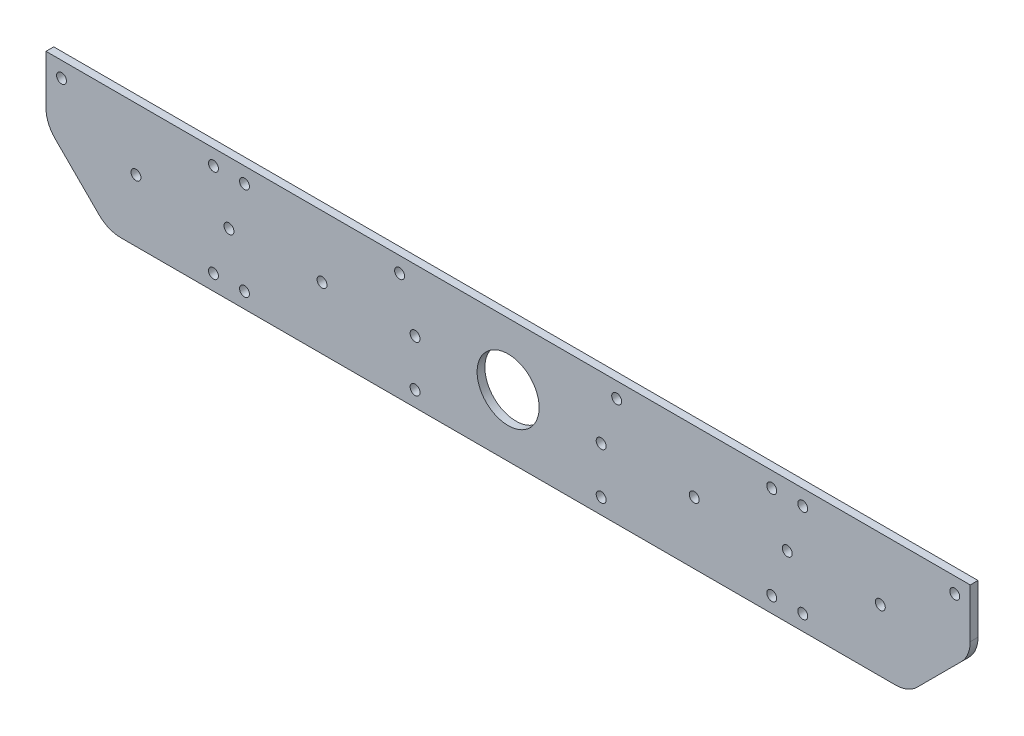
ISO-10303-21;
HEADER;
FILE_DESCRIPTION(('STEP AP214'),'2;1');
FILE_NAME('part.step','',(''),(''),'','','');
FILE_SCHEMA(('AUTOMOTIVE_DESIGN { 1 0 10303 214 1 1 1 1 }'));
ENDSEC;
DATA;
#1=APPLICATION_CONTEXT('core data for automotive mechanical design processes');
#2=APPLICATION_PROTOCOL_DEFINITION('international standard','automotive_design',2000,#1);
#3=PRODUCT_CONTEXT('',#1,'mechanical');
#4=PRODUCT('Part','Part','',(#3));
#5=PRODUCT_RELATED_PRODUCT_CATEGORY('part','',(#4));
#6=PRODUCT_DEFINITION_FORMATION('','',#4);
#7=PRODUCT_DEFINITION_CONTEXT('part definition',#1,'design');
#8=PRODUCT_DEFINITION('design','',#6,#7);
#9=PRODUCT_DEFINITION_SHAPE('','',#8);
#10=(LENGTH_UNIT() NAMED_UNIT(*) SI_UNIT(.MILLI.,.METRE.));
#11=(NAMED_UNIT(*) PLANE_ANGLE_UNIT() SI_UNIT($,.RADIAN.));
#12=(NAMED_UNIT(*) SI_UNIT($,.STERADIAN.) SOLID_ANGLE_UNIT());
#13=UNCERTAINTY_MEASURE_WITH_UNIT(LENGTH_MEASURE(1.E-05),#10,'distance_accuracy_value','');
#14=(GEOMETRIC_REPRESENTATION_CONTEXT(3) GLOBAL_UNCERTAINTY_ASSIGNED_CONTEXT((#13)) GLOBAL_UNIT_ASSIGNED_CONTEXT((#10,
#11,#12)) REPRESENTATION_CONTEXT('',''));
#15=CARTESIAN_POINT('',(0.,0.,0.));
#16=DIRECTION('',(0.,0.,1.));
#17=DIRECTION('',(1.,0.,0.));
#18=AXIS2_PLACEMENT_3D('',#15,#16,#17);
#19=CARTESIAN_POINT('',(0.,0.,3.175));
#20=DIRECTION('',(0.,0.,-1.));
#21=DIRECTION('',(-1.,0.,0.));
#22=AXIS2_PLACEMENT_3D('',#19,#20,#21);
#23=PLANE('',#22);
#24=CARTESIAN_POINT('',(182.88,19.05,3.175));
#25=DIRECTION('',(0.,0.,-1.));
#26=DIRECTION('',(-1.,0.,0.));
#27=AXIS2_PLACEMENT_3D('',#24,#25,#26);
#28=CIRCLE('',#27,2.03200000000001);
#29=CARTESIAN_POINT('',(180.848,19.05,3.175));
#30=VERTEX_POINT('',#29);
#31=EDGE_CURVE('E197',#30,#30,#28,.T.);
#32=ORIENTED_EDGE('',*,*,#31,.T.);
#33=EDGE_LOOP('',(#32));
#34=FACE_BOUND('',#33,.T.);
#35=CARTESIAN_POINT('',(107.95,19.05,3.175));
#36=DIRECTION('',(0.,0.,-1.));
#37=DIRECTION('',(-1.,0.,0.));
#38=AXIS2_PLACEMENT_3D('',#35,#36,#37);
#39=CIRCLE('',#38,2.03200000000001);
#40=CARTESIAN_POINT('',(105.918,19.05,3.175));
#41=VERTEX_POINT('',#40);
#42=EDGE_CURVE('E207',#41,#41,#39,.T.);
#43=ORIENTED_EDGE('',*,*,#42,.T.);
#44=EDGE_LOOP('',(#43));
#45=FACE_BOUND('',#44,.T.);
#46=CARTESIAN_POINT('',(120.65,19.0499999999999,3.175));
#47=DIRECTION('',(0.,0.,-1.));
#48=DIRECTION('',(-1.,0.,0.));
#49=AXIS2_PLACEMENT_3D('',#46,#47,#48);
#50=CIRCLE('',#49,2.03200000000001);
#51=CARTESIAN_POINT('',(118.618,19.0499999999999,3.175));
#52=VERTEX_POINT('',#51);
#53=EDGE_CURVE('E220',#52,#52,#50,.T.);
#54=ORIENTED_EDGE('',*,*,#53,.T.);
#55=EDGE_LOOP('',(#54));
#56=FACE_BOUND('',#55,.T.);
#57=CARTESIAN_POINT('',(120.65,-19.0500000000001,3.175));
#58=DIRECTION('',(0.,0.,-1.));
#59=DIRECTION('',(-1.,0.,0.));
#60=AXIS2_PLACEMENT_3D('',#57,#58,#59);
#61=CIRCLE('',#60,2.03200000000001);
#62=CARTESIAN_POINT('',(118.618,-19.0500000000001,3.175));
#63=VERTEX_POINT('',#62);
#64=EDGE_CURVE('E214',#63,#63,#61,.T.);
#65=ORIENTED_EDGE('',*,*,#64,.T.);
#66=EDGE_LOOP('',(#65));
#67=FACE_BOUND('',#66,.T.);
#68=CARTESIAN_POINT('',(107.95,-19.05,3.175));
#69=DIRECTION('',(0.,0.,-1.));
#70=DIRECTION('',(-1.,0.,0.));
#71=AXIS2_PLACEMENT_3D('',#68,#69,#70);
#72=CIRCLE('',#71,2.03200000000001);
#73=CARTESIAN_POINT('',(105.918,-19.05,3.175));
#74=VERTEX_POINT('',#73);
#75=EDGE_CURVE('E213',#74,#74,#72,.T.);
#76=ORIENTED_EDGE('',*,*,#75,.T.);
#77=EDGE_LOOP('',(#76));
#78=FACE_BOUND('',#77,.T.);
#79=CARTESIAN_POINT('',(-182.88,19.05,3.175));
#80=DIRECTION('',(0.,0.,1.));
#81=DIRECTION('',(1.,0.,0.));
#82=AXIS2_PLACEMENT_3D('',#79,#80,#81);
#83=CIRCLE('',#82,2.03200000000001);
#84=CARTESIAN_POINT('',(-180.848,19.05,3.175));
#85=VERTEX_POINT('',#84);
#86=EDGE_CURVE('E231',#85,#85,#83,.T.);
#87=ORIENTED_EDGE('',*,*,#86,.F.);
#88=EDGE_LOOP('',(#87));
#89=FACE_BOUND('',#88,.T.);
#90=CARTESIAN_POINT('',(-107.95,19.05,3.175));
#91=DIRECTION('',(0.,0.,1.));
#92=DIRECTION('',(1.,0.,0.));
#93=AXIS2_PLACEMENT_3D('',#90,#91,#92);
#94=CIRCLE('',#93,2.03200000000001);
#95=CARTESIAN_POINT('',(-105.918,19.05,3.175));
#96=VERTEX_POINT('',#95);
#97=EDGE_CURVE('E237',#96,#96,#94,.T.);
#98=ORIENTED_EDGE('',*,*,#97,.F.);
#99=EDGE_LOOP('',(#98));
#100=FACE_BOUND('',#99,.T.);
#101=CARTESIAN_POINT('',(-120.65,19.0499999999999,3.175));
#102=DIRECTION('',(0.,0.,1.));
#103=DIRECTION('',(1.,0.,0.));
#104=AXIS2_PLACEMENT_3D('',#101,#102,#103);
#105=CIRCLE('',#104,2.03200000000001);
#106=CARTESIAN_POINT('',(-118.618,19.0499999999999,3.175));
#107=VERTEX_POINT('',#106);
#108=EDGE_CURVE('E252',#107,#107,#105,.T.);
#109=ORIENTED_EDGE('',*,*,#108,.F.);
#110=EDGE_LOOP('',(#109));
#111=FACE_BOUND('',#110,.T.);
#112=CARTESIAN_POINT('',(-120.65,-19.0500000000001,3.175));
#113=DIRECTION('',(0.,0.,1.));
#114=DIRECTION('',(1.,0.,0.));
#115=AXIS2_PLACEMENT_3D('',#112,#113,#114);
#116=CIRCLE('',#115,2.03200000000001);
#117=CARTESIAN_POINT('',(-118.618,-19.0500000000001,3.175));
#118=VERTEX_POINT('',#117);
#119=EDGE_CURVE('E245',#118,#118,#116,.T.);
#120=ORIENTED_EDGE('',*,*,#119,.F.);
#121=EDGE_LOOP('',(#120));
#122=FACE_BOUND('',#121,.T.);
#123=CARTESIAN_POINT('',(-107.95,-19.05,3.175));
#124=DIRECTION('',(0.,0.,1.));
#125=DIRECTION('',(1.,0.,0.));
#126=AXIS2_PLACEMENT_3D('',#123,#124,#125);
#127=CIRCLE('',#126,2.03200000000001);
#128=CARTESIAN_POINT('',(-105.918,-19.05,3.175));
#129=VERTEX_POINT('',#128);
#130=EDGE_CURVE('E244',#129,#129,#127,.T.);
#131=ORIENTED_EDGE('',*,*,#130,.F.);
#132=EDGE_LOOP('',(#131));
#133=FACE_BOUND('',#132,.T.);
#134=CARTESIAN_POINT('',(38.0999999999998,-19.0500000000006,3.175));
#135=DIRECTION('',(0.,0.,1.));
#136=DIRECTION('',(1.,0.,0.));
#137=AXIS2_PLACEMENT_3D('',#134,#135,#136);
#138=CIRCLE('',#137,2.03199999999934);
#139=CARTESIAN_POINT('',(40.1319999999991,-19.0500000000006,3.175));
#140=VERTEX_POINT('',#139);
#141=EDGE_CURVE('E264',#140,#140,#138,.T.);
#142=ORIENTED_EDGE('',*,*,#141,.F.);
#143=EDGE_LOOP('',(#142));
#144=FACE_BOUND('',#143,.T.);
#145=CARTESIAN_POINT('',(44.4499999999998,19.0499999999994,3.175));
#146=DIRECTION('',(0.,0.,1.));
#147=DIRECTION('',(1.,0.,0.));
#148=AXIS2_PLACEMENT_3D('',#145,#146,#147);
#149=CIRCLE('',#148,2.03199999999934);
#150=CARTESIAN_POINT('',(46.4819999999991,19.0499999999994,3.175));
#151=VERTEX_POINT('',#150);
#152=EDGE_CURVE('E278',#151,#151,#149,.T.);
#153=ORIENTED_EDGE('',*,*,#152,.F.);
#154=EDGE_LOOP('',(#153));
#155=FACE_BOUND('',#154,.T.);
#156=CARTESIAN_POINT('',(-44.4500000000002,19.0499999999994,3.175));
#157=DIRECTION('',(0.,0.,1.));
#158=DIRECTION('',(1.,0.,0.));
#159=AXIS2_PLACEMENT_3D('',#156,#157,#158);
#160=CIRCLE('',#159,2.03199999999934);
#161=CARTESIAN_POINT('',(-42.4180000000009,19.0499999999994,3.175));
#162=VERTEX_POINT('',#161);
#163=EDGE_CURVE('E272',#162,#162,#160,.T.);
#164=ORIENTED_EDGE('',*,*,#163,.F.);
#165=EDGE_LOOP('',(#164));
#166=FACE_BOUND('',#165,.T.);
#167=CARTESIAN_POINT('',(-38.1000000000003,-19.0500000000006,3.175));
#168=DIRECTION('',(0.,0.,1.));
#169=DIRECTION('',(1.,0.,0.));
#170=AXIS2_PLACEMENT_3D('',#167,#168,#169);
#171=CIRCLE('',#170,2.03199999999934);
#172=CARTESIAN_POINT('',(-36.0680000000009,-19.0500000000006,3.175));
#173=VERTEX_POINT('',#172);
#174=EDGE_CURVE('E271',#173,#173,#171,.T.);
#175=ORIENTED_EDGE('',*,*,#174,.F.);
#176=EDGE_LOOP('',(#175));
#177=FACE_BOUND('',#176,.T.);
#178=CARTESIAN_POINT('',(0.,0.,3.175));
#179=DIRECTION('',(0.,0.,1.));
#180=DIRECTION('',(1.,0.,0.));
#181=AXIS2_PLACEMENT_3D('',#178,#179,#180);
#182=CIRCLE('',#181,12.6999999999993);
#183=CARTESIAN_POINT('',(12.6999999999993,0.,3.175));
#184=VERTEX_POINT('',#183);
#185=EDGE_CURVE('E289',#184,#184,#182,.T.);
#186=ORIENTED_EDGE('',*,*,#185,.F.);
#187=EDGE_LOOP('',(#186));
#188=FACE_BOUND('',#187,.T.);
#189=DIRECTION('',(-0.707106781186547,-0.707106781186547,0.));
#190=VECTOR('',#189,1.);
#191=CARTESIAN_POINT('',(189.23,0.,3.175));
#192=LINE('',#191,#190);
#193=CARTESIAN_POINT('',(185.510256121069,-3.71974387893083,3.175));
#194=VERTEX_POINT('',#193);
#195=CARTESIAN_POINT('',(167.549743878931,-21.6802561210691,3.175));
#196=VERTEX_POINT('',#195);
#197=EDGE_CURVE('E199',#194,#196,#192,.T.);
#198=ORIENTED_EDGE('',*,*,#197,.F.);
#199=CARTESIAN_POINT('',(176.53,5.26051224213832,3.175));
#200=DIRECTION('',(0.,0.,-1.));
#201=DIRECTION('',(-1.,0.,0.));
#202=AXIS2_PLACEMENT_3D('',#199,#200,#201);
#203=CIRCLE('',#202,12.7);
#204=CARTESIAN_POINT('',(189.23,5.26051224213832,3.175));
#205=VERTEX_POINT('',#204);
#206=EDGE_CURVE('E122',#194,#205,#203,.F.);
#207=ORIENTED_EDGE('',*,*,#206,.T.);
#208=DIRECTION('',(0.,1.,0.));
#209=VECTOR('',#208,1.);
#210=CARTESIAN_POINT('',(189.23,-25.4,3.175));
#211=LINE('',#210,#209);
#212=CARTESIAN_POINT('',(189.23,25.4,3.175));
#213=VERTEX_POINT('',#212);
#214=EDGE_CURVE('E114',#205,#213,#211,.T.);
#215=ORIENTED_EDGE('',*,*,#214,.T.);
#216=DIRECTION('',(-1.,0.,0.));
#217=VECTOR('',#216,1.);
#218=CARTESIAN_POINT('',(-189.23,25.4,3.175));
#219=LINE('',#218,#217);
#220=CARTESIAN_POINT('',(-189.23,25.4,3.175));
#221=VERTEX_POINT('',#220);
#222=EDGE_CURVE('E120',#213,#221,#219,.T.);
#223=ORIENTED_EDGE('',*,*,#222,.T.);
#224=DIRECTION('',(0.,-1.,0.));
#225=VECTOR('',#224,1.);
#226=CARTESIAN_POINT('',(-189.23,-25.4,3.175));
#227=LINE('',#226,#225);
#228=CARTESIAN_POINT('',(-189.23,5.26051224213832,3.175));
#229=VERTEX_POINT('',#228);
#230=EDGE_CURVE('E153',#221,#229,#227,.T.);
#231=ORIENTED_EDGE('',*,*,#230,.T.);
#232=CARTESIAN_POINT('',(-176.53,5.26051224213832,3.175));
#233=DIRECTION('',(0.,0.,-1.));
#234=DIRECTION('',(-1.,0.,0.));
#235=AXIS2_PLACEMENT_3D('',#232,#233,#234);
#236=CIRCLE('',#235,12.7);
#237=CARTESIAN_POINT('',(-185.510256121069,-3.71974387893084,3.175));
#238=VERTEX_POINT('',#237);
#239=EDGE_CURVE('E161',#229,#238,#236,.F.);
#240=ORIENTED_EDGE('',*,*,#239,.T.);
#241=DIRECTION('',(-0.707106781186547,0.707106781186547,0.));
#242=VECTOR('',#241,1.);
#243=CARTESIAN_POINT('',(-189.23,0.,3.175));
#244=LINE('',#243,#242);
#245=CARTESIAN_POINT('',(-167.549743878931,-21.6802561210692,3.175));
#246=VERTEX_POINT('',#245);
#247=EDGE_CURVE('E188',#246,#238,#244,.T.);
#248=ORIENTED_EDGE('',*,*,#247,.F.);
#249=CARTESIAN_POINT('',(-158.569487757862,-12.7,3.175));
#250=DIRECTION('',(0.,0.,-1.));
#251=DIRECTION('',(-1.,0.,0.));
#252=AXIS2_PLACEMENT_3D('',#249,#250,#251);
#253=CIRCLE('',#252,12.7);
#254=CARTESIAN_POINT('',(-158.569487757862,-25.4,3.175));
#255=VERTEX_POINT('',#254);
#256=EDGE_CURVE('E159',#246,#255,#253,.F.);
#257=ORIENTED_EDGE('',*,*,#256,.T.);
#258=DIRECTION('',(1.,0.,0.));
#259=VECTOR('',#258,1.);
#260=CARTESIAN_POINT('',(-189.23,-25.4,3.175));
#261=LINE('',#260,#259);
#262=CARTESIAN_POINT('',(158.569487757862,-25.4,3.175));
#263=VERTEX_POINT('',#262);
#264=EDGE_CURVE('E125',#255,#263,#261,.T.);
#265=ORIENTED_EDGE('',*,*,#264,.T.);
#266=CARTESIAN_POINT('',(158.569487757862,-12.7,3.175));
#267=DIRECTION('',(0.,0.,-1.));
#268=DIRECTION('',(-1.,0.,0.));
#269=AXIS2_PLACEMENT_3D('',#266,#267,#268);
#270=CIRCLE('',#269,12.7);
#271=EDGE_CURVE('E163',#263,#196,#270,.F.);
#272=ORIENTED_EDGE('',*,*,#271,.T.);
#273=EDGE_LOOP('',(#198,#207,#215,#223,#231,#240,#248,#257,#265,#272));
#274=FACE_BOUND('',#273,.T.);
#275=CARTESIAN_POINT('',(76.2,-5.13478148889135E-13,3.175));
#276=DIRECTION('',(0.,0.,1.));
#277=DIRECTION('',(-1.,0.,0.));
#278=AXIS2_PLACEMENT_3D('',#275,#276,#277);
#279=CIRCLE('',#278,2.03199999999999);
#280=CARTESIAN_POINT('',(74.168,-5.13478148889135E-13,3.175));
#281=VERTEX_POINT('',#280);
#282=EDGE_CURVE('E148',#281,#281,#279,.T.);
#283=ORIENTED_EDGE('',*,*,#282,.F.);
#284=EDGE_LOOP('',(#283));
#285=FACE_BOUND('',#284,.T.);
#286=CARTESIAN_POINT('',(-38.1,-2.67147415300428E-13,3.175));
#287=DIRECTION('',(0.,0.,1.));
#288=DIRECTION('',(1.,0.,0.));
#289=AXIS2_PLACEMENT_3D('',#286,#287,#288);
#290=CIRCLE('',#289,2.032);
#291=CARTESIAN_POINT('',(-36.068,-2.67147415300428E-13,3.175));
#292=VERTEX_POINT('',#291);
#293=EDGE_CURVE('E336',#292,#292,#290,.T.);
#294=ORIENTED_EDGE('',*,*,#293,.F.);
#295=EDGE_LOOP('',(#294));
#296=FACE_BOUND('',#295,.T.);
#297=CARTESIAN_POINT('',(-76.2,-5.30825383648903E-13,3.175));
#298=DIRECTION('',(0.,0.,1.));
#299=DIRECTION('',(1.,0.,0.));
#300=AXIS2_PLACEMENT_3D('',#297,#298,#299);
#301=CIRCLE('',#300,2.03199999999999);
#302=CARTESIAN_POINT('',(-74.168,-5.30825383648903E-13,3.175));
#303=VERTEX_POINT('',#302);
#304=EDGE_CURVE('E330',#303,#303,#301,.T.);
#305=ORIENTED_EDGE('',*,*,#304,.F.);
#306=EDGE_LOOP('',(#305));
#307=FACE_BOUND('',#306,.T.);
#308=CARTESIAN_POINT('',(-114.3,-7.97972798949331E-13,3.175));
#309=DIRECTION('',(0.,0.,1.));
#310=DIRECTION('',(1.,0.,0.));
#311=AXIS2_PLACEMENT_3D('',#308,#309,#310);
#312=CIRCLE('',#311,2.03199999999999);
#313=CARTESIAN_POINT('',(-112.268,-7.97972798949331E-13,3.175));
#314=VERTEX_POINT('',#313);
#315=EDGE_CURVE('E322',#314,#314,#312,.T.);
#316=ORIENTED_EDGE('',*,*,#315,.F.);
#317=EDGE_LOOP('',(#316));
#318=FACE_BOUND('',#317,.T.);
#319=CARTESIAN_POINT('',(-152.4,-1.06512021424976E-12,3.175));
#320=DIRECTION('',(0.,0.,1.));
#321=DIRECTION('',(1.,0.,0.));
#322=AXIS2_PLACEMENT_3D('',#319,#320,#321);
#323=CIRCLE('',#322,2.03200000000001);
#324=CARTESIAN_POINT('',(-150.368,-1.06512021424976E-12,3.175));
#325=VERTEX_POINT('',#324);
#326=EDGE_CURVE('E316',#325,#325,#323,.T.);
#327=ORIENTED_EDGE('',*,*,#326,.F.);
#328=EDGE_LOOP('',(#327));
#329=FACE_BOUND('',#328,.T.);
#330=CARTESIAN_POINT('',(114.3,-7.70217223333702E-13,3.175));
#331=DIRECTION('',(0.,0.,1.));
#332=DIRECTION('',(-1.,0.,0.));
#333=AXIS2_PLACEMENT_3D('',#330,#331,#332);
#334=CIRCLE('',#333,2.03199999999999);
#335=CARTESIAN_POINT('',(112.268,-7.70217223333702E-13,3.175));
#336=VERTEX_POINT('',#335);
#337=EDGE_CURVE('E310',#336,#336,#334,.T.);
#338=ORIENTED_EDGE('',*,*,#337,.F.);
#339=EDGE_LOOP('',(#338));
#340=FACE_BOUND('',#339,.T.);
#341=CARTESIAN_POINT('',(152.4,-1.02695629777827E-12,3.175));
#342=DIRECTION('',(0.,0.,1.));
#343=DIRECTION('',(-1.,0.,0.));
#344=AXIS2_PLACEMENT_3D('',#341,#342,#343);
#345=CIRCLE('',#344,2.03200000000001);
#346=CARTESIAN_POINT('',(150.368,-1.02695629777827E-12,3.175));
#347=VERTEX_POINT('',#346);
#348=EDGE_CURVE('E304',#347,#347,#345,.T.);
#349=ORIENTED_EDGE('',*,*,#348,.F.);
#350=EDGE_LOOP('',(#349));
#351=FACE_BOUND('',#350,.T.);
#352=CARTESIAN_POINT('',(38.1,-2.56739074444567E-13,3.175));
#353=DIRECTION('',(0.,0.,1.));
#354=DIRECTION('',(-1.,0.,0.));
#355=AXIS2_PLACEMENT_3D('',#352,#353,#354);
#356=CIRCLE('',#355,2.032);
#357=CARTESIAN_POINT('',(36.068,-2.56739074444567E-13,3.175));
#358=VERTEX_POINT('',#357);
#359=EDGE_CURVE('E298',#358,#358,#356,.T.);
#360=ORIENTED_EDGE('',*,*,#359,.F.);
#361=EDGE_LOOP('',(#360));
#362=FACE_BOUND('',#361,.T.);
#363=ADVANCED_FACE('F37',(#34,#45,#56,#67,#78,#89,#100,#111,#122,#133,#144,#155,#166,#177,#188,
#274,#285,#296,#307,#318,#329,#340,#351,#362),#23,.F.);
#364=CARTESIAN_POINT('',(0.,0.,0.));
#365=DIRECTION('',(0.,0.,-1.));
#366=DIRECTION('',(-1.,0.,0.));
#367=AXIS2_PLACEMENT_3D('',#364,#365,#366);
#368=PLANE('',#367);
#369=DIRECTION('',(0.,1.,0.));
#370=VECTOR('',#369,1.);
#371=CARTESIAN_POINT('',(189.23,-25.4,0.));
#372=LINE('',#371,#370);
#373=CARTESIAN_POINT('',(189.23,5.26051224213832,0.));
#374=VERTEX_POINT('',#373);
#375=CARTESIAN_POINT('',(189.23,25.4,0.));
#376=VERTEX_POINT('',#375);
#377=EDGE_CURVE('E131',#374,#376,#372,.T.);
#378=ORIENTED_EDGE('',*,*,#377,.F.);
#379=CARTESIAN_POINT('',(176.53,5.26051224213832,0.));
#380=DIRECTION('',(0.,0.,-1.));
#381=DIRECTION('',(-1.,0.,0.));
#382=AXIS2_PLACEMENT_3D('',#379,#380,#381);
#383=CIRCLE('',#382,12.7);
#384=CARTESIAN_POINT('',(185.510256121069,-3.71974387893083,0.));
#385=VERTEX_POINT('',#384);
#386=EDGE_CURVE('E173',#374,#385,#383,.T.);
#387=ORIENTED_EDGE('',*,*,#386,.T.);
#388=DIRECTION('',(-0.707106781186547,-0.707106781186547,0.));
#389=VECTOR('',#388,1.);
#390=CARTESIAN_POINT('',(189.23,0.,0.));
#391=LINE('',#390,#389);
#392=CARTESIAN_POINT('',(167.549743878931,-21.6802561210691,0.));
#393=VERTEX_POINT('',#392);
#394=EDGE_CURVE('E195',#385,#393,#391,.T.);
#395=ORIENTED_EDGE('',*,*,#394,.T.);
#396=CARTESIAN_POINT('',(158.569487757862,-12.7,0.));
#397=DIRECTION('',(0.,0.,-1.));
#398=DIRECTION('',(-1.,0.,0.));
#399=AXIS2_PLACEMENT_3D('',#396,#397,#398);
#400=CIRCLE('',#399,12.7);
#401=CARTESIAN_POINT('',(158.569487757862,-25.4,0.));
#402=VERTEX_POINT('',#401);
#403=EDGE_CURVE('E52',#393,#402,#400,.T.);
#404=ORIENTED_EDGE('',*,*,#403,.T.);
#405=DIRECTION('',(1.,0.,0.));
#406=VECTOR('',#405,1.);
#407=CARTESIAN_POINT('',(-189.23,-25.4,0.));
#408=LINE('',#407,#406);
#409=CARTESIAN_POINT('',(-158.569487757862,-25.4,0.));
#410=VERTEX_POINT('',#409);
#411=EDGE_CURVE('E147',#410,#402,#408,.T.);
#412=ORIENTED_EDGE('',*,*,#411,.F.);
#413=CARTESIAN_POINT('',(-158.569487757862,-12.7,0.));
#414=DIRECTION('',(0.,0.,-1.));
#415=DIRECTION('',(-1.,0.,0.));
#416=AXIS2_PLACEMENT_3D('',#413,#414,#415);
#417=CIRCLE('',#416,12.7);
#418=CARTESIAN_POINT('',(-167.549743878931,-21.6802561210692,0.));
#419=VERTEX_POINT('',#418);
#420=EDGE_CURVE('E168',#410,#419,#417,.T.);
#421=ORIENTED_EDGE('',*,*,#420,.T.);
#422=DIRECTION('',(-0.707106781186547,0.707106781186547,0.));
#423=VECTOR('',#422,1.);
#424=CARTESIAN_POINT('',(-189.23,0.,0.));
#425=LINE('',#424,#423);
#426=CARTESIAN_POINT('',(-185.510256121069,-3.71974387893084,0.));
#427=VERTEX_POINT('',#426);
#428=EDGE_CURVE('E191',#419,#427,#425,.T.);
#429=ORIENTED_EDGE('',*,*,#428,.T.);
#430=CARTESIAN_POINT('',(-176.53,5.26051224213832,0.));
#431=DIRECTION('',(0.,0.,-1.));
#432=DIRECTION('',(-1.,0.,0.));
#433=AXIS2_PLACEMENT_3D('',#430,#431,#432);
#434=CIRCLE('',#433,12.7);
#435=CARTESIAN_POINT('',(-189.23,5.26051224213832,0.));
#436=VERTEX_POINT('',#435);
#437=EDGE_CURVE('E170',#427,#436,#434,.T.);
#438=ORIENTED_EDGE('',*,*,#437,.T.);
#439=DIRECTION('',(0.,-1.,0.));
#440=VECTOR('',#439,1.);
#441=CARTESIAN_POINT('',(-189.23,-25.4,0.));
#442=LINE('',#441,#440);
#443=CARTESIAN_POINT('',(-189.23,25.4,0.));
#444=VERTEX_POINT('',#443);
#445=EDGE_CURVE('E144',#444,#436,#442,.T.);
#446=ORIENTED_EDGE('',*,*,#445,.F.);
#447=DIRECTION('',(-1.,0.,0.));
#448=VECTOR('',#447,1.);
#449=CARTESIAN_POINT('',(-189.23,25.4,0.));
#450=LINE('',#449,#448);
#451=EDGE_CURVE('E152',#376,#444,#450,.T.);
#452=ORIENTED_EDGE('',*,*,#451,.F.);
#453=EDGE_LOOP('',(#378,#387,#395,#404,#412,#421,#429,#438,#446,#452));
#454=FACE_BOUND('',#453,.T.);
#455=CARTESIAN_POINT('',(182.88,19.05,0.));
#456=DIRECTION('',(0.,0.,-1.));
#457=DIRECTION('',(-1.,0.,0.));
#458=AXIS2_PLACEMENT_3D('',#455,#456,#457);
#459=CIRCLE('',#458,2.03200000000001);
#460=CARTESIAN_POINT('',(180.848,19.05,0.));
#461=VERTEX_POINT('',#460);
#462=EDGE_CURVE('E204',#461,#461,#459,.T.);
#463=ORIENTED_EDGE('',*,*,#462,.F.);
#464=EDGE_LOOP('',(#463));
#465=FACE_BOUND('',#464,.T.);
#466=CARTESIAN_POINT('',(107.95,19.05,0.));
#467=DIRECTION('',(0.,0.,-1.));
#468=DIRECTION('',(-1.,0.,0.));
#469=AXIS2_PLACEMENT_3D('',#466,#467,#468);
#470=CIRCLE('',#469,2.03200000000001);
#471=CARTESIAN_POINT('',(105.918,19.05,0.));
#472=VERTEX_POINT('',#471);
#473=EDGE_CURVE('E223',#472,#472,#470,.T.);
#474=ORIENTED_EDGE('',*,*,#473,.F.);
#475=EDGE_LOOP('',(#474));
#476=FACE_BOUND('',#475,.T.);
#477=CARTESIAN_POINT('',(120.65,19.0499999999999,0.));
#478=DIRECTION('',(0.,0.,-1.));
#479=DIRECTION('',(-1.,0.,0.));
#480=AXIS2_PLACEMENT_3D('',#477,#478,#479);
#481=CIRCLE('',#480,2.03200000000001);
#482=CARTESIAN_POINT('',(118.618,19.0499999999999,0.));
#483=VERTEX_POINT('',#482);
#484=EDGE_CURVE('E217',#483,#483,#481,.T.);
#485=ORIENTED_EDGE('',*,*,#484,.F.);
#486=EDGE_LOOP('',(#485));
#487=FACE_BOUND('',#486,.T.);
#488=CARTESIAN_POINT('',(120.65,-19.0500000000001,0.));
#489=DIRECTION('',(0.,0.,-1.));
#490=DIRECTION('',(-1.,0.,0.));
#491=AXIS2_PLACEMENT_3D('',#488,#489,#490);
#492=CIRCLE('',#491,2.03200000000001);
#493=CARTESIAN_POINT('',(118.618,-19.0500000000001,0.));
#494=VERTEX_POINT('',#493);
#495=EDGE_CURVE('E210',#494,#494,#492,.T.);
#496=ORIENTED_EDGE('',*,*,#495,.F.);
#497=EDGE_LOOP('',(#496));
#498=FACE_BOUND('',#497,.T.);
#499=CARTESIAN_POINT('',(107.95,-19.05,0.));
#500=DIRECTION('',(0.,0.,-1.));
#501=DIRECTION('',(-1.,0.,0.));
#502=AXIS2_PLACEMENT_3D('',#499,#500,#501);
#503=CIRCLE('',#502,2.03200000000001);
#504=CARTESIAN_POINT('',(105.918,-19.05,0.));
#505=VERTEX_POINT('',#504);
#506=EDGE_CURVE('E228',#505,#505,#503,.T.);
#507=ORIENTED_EDGE('',*,*,#506,.F.);
#508=EDGE_LOOP('',(#507));
#509=FACE_BOUND('',#508,.T.);
#510=CARTESIAN_POINT('',(-182.88,19.05,0.));
#511=DIRECTION('',(0.,0.,1.));
#512=DIRECTION('',(1.,0.,0.));
#513=AXIS2_PLACEMENT_3D('',#510,#511,#512);
#514=CIRCLE('',#513,2.03200000000001);
#515=CARTESIAN_POINT('',(-180.848,19.05,0.));
#516=VERTEX_POINT('',#515);
#517=EDGE_CURVE('E234',#516,#516,#514,.T.);
#518=ORIENTED_EDGE('',*,*,#517,.T.);
#519=EDGE_LOOP('',(#518));
#520=FACE_BOUND('',#519,.T.);
#521=CARTESIAN_POINT('',(-107.95,19.05,0.));
#522=DIRECTION('',(0.,0.,1.));
#523=DIRECTION('',(1.,0.,0.));
#524=AXIS2_PLACEMENT_3D('',#521,#522,#523);
#525=CIRCLE('',#524,2.03200000000001);
#526=CARTESIAN_POINT('',(-105.918,19.05,0.));
#527=VERTEX_POINT('',#526);
#528=EDGE_CURVE('E255',#527,#527,#525,.T.);
#529=ORIENTED_EDGE('',*,*,#528,.T.);
#530=EDGE_LOOP('',(#529));
#531=FACE_BOUND('',#530,.T.);
#532=CARTESIAN_POINT('',(-120.65,19.0499999999999,0.));
#533=DIRECTION('',(0.,0.,1.));
#534=DIRECTION('',(1.,0.,0.));
#535=AXIS2_PLACEMENT_3D('',#532,#533,#534);
#536=CIRCLE('',#535,2.03200000000001);
#537=CARTESIAN_POINT('',(-118.618,19.0499999999999,0.));
#538=VERTEX_POINT('',#537);
#539=EDGE_CURVE('E249',#538,#538,#536,.T.);
#540=ORIENTED_EDGE('',*,*,#539,.T.);
#541=EDGE_LOOP('',(#540));
#542=FACE_BOUND('',#541,.T.);
#543=CARTESIAN_POINT('',(-120.65,-19.0500000000001,0.));
#544=DIRECTION('',(0.,0.,1.));
#545=DIRECTION('',(1.,0.,0.));
#546=AXIS2_PLACEMENT_3D('',#543,#544,#545);
#547=CIRCLE('',#546,2.03200000000001);
#548=CARTESIAN_POINT('',(-118.618,-19.0500000000001,0.));
#549=VERTEX_POINT('',#548);
#550=EDGE_CURVE('E240',#549,#549,#547,.T.);
#551=ORIENTED_EDGE('',*,*,#550,.T.);
#552=EDGE_LOOP('',(#551));
#553=FACE_BOUND('',#552,.T.);
#554=CARTESIAN_POINT('',(-107.95,-19.05,0.));
#555=DIRECTION('',(0.,0.,1.));
#556=DIRECTION('',(1.,0.,0.));
#557=AXIS2_PLACEMENT_3D('',#554,#555,#556);
#558=CIRCLE('',#557,2.03200000000001);
#559=CARTESIAN_POINT('',(-105.918,-19.05,0.));
#560=VERTEX_POINT('',#559);
#561=EDGE_CURVE('E260',#560,#560,#558,.T.);
#562=ORIENTED_EDGE('',*,*,#561,.T.);
#563=EDGE_LOOP('',(#562));
#564=FACE_BOUND('',#563,.T.);
#565=CARTESIAN_POINT('',(38.0999999999998,-19.0500000000006,0.));
#566=DIRECTION('',(0.,0.,1.));
#567=DIRECTION('',(1.,0.,0.));
#568=AXIS2_PLACEMENT_3D('',#565,#566,#567);
#569=CIRCLE('',#568,2.03199999999934);
#570=CARTESIAN_POINT('',(40.1319999999991,-19.0500000000006,0.));
#571=VERTEX_POINT('',#570);
#572=EDGE_CURVE('E281',#571,#571,#569,.T.);
#573=ORIENTED_EDGE('',*,*,#572,.T.);
#574=EDGE_LOOP('',(#573));
#575=FACE_BOUND('',#574,.T.);
#576=CARTESIAN_POINT('',(44.4499999999998,19.0499999999994,0.));
#577=DIRECTION('',(0.,0.,1.));
#578=DIRECTION('',(1.,0.,0.));
#579=AXIS2_PLACEMENT_3D('',#576,#577,#578);
#580=CIRCLE('',#579,2.03199999999934);
#581=CARTESIAN_POINT('',(46.4819999999991,19.0499999999994,0.));
#582=VERTEX_POINT('',#581);
#583=EDGE_CURVE('E275',#582,#582,#580,.T.);
#584=ORIENTED_EDGE('',*,*,#583,.T.);
#585=EDGE_LOOP('',(#584));
#586=FACE_BOUND('',#585,.T.);
#587=CARTESIAN_POINT('',(-44.4500000000002,19.0499999999994,0.));
#588=DIRECTION('',(0.,0.,1.));
#589=DIRECTION('',(1.,0.,0.));
#590=AXIS2_PLACEMENT_3D('',#587,#588,#589);
#591=CIRCLE('',#590,2.03199999999934);
#592=CARTESIAN_POINT('',(-42.4180000000009,19.0499999999994,0.));
#593=VERTEX_POINT('',#592);
#594=EDGE_CURVE('E268',#593,#593,#591,.T.);
#595=ORIENTED_EDGE('',*,*,#594,.T.);
#596=EDGE_LOOP('',(#595));
#597=FACE_BOUND('',#596,.T.);
#598=CARTESIAN_POINT('',(-38.1000000000003,-19.0500000000006,0.));
#599=DIRECTION('',(0.,0.,1.));
#600=DIRECTION('',(1.,0.,0.));
#601=AXIS2_PLACEMENT_3D('',#598,#599,#600);
#602=CIRCLE('',#601,2.03199999999934);
#603=CARTESIAN_POINT('',(-36.0680000000009,-19.0500000000006,0.));
#604=VERTEX_POINT('',#603);
#605=EDGE_CURVE('E286',#604,#604,#602,.T.);
#606=ORIENTED_EDGE('',*,*,#605,.T.);
#607=EDGE_LOOP('',(#606));
#608=FACE_BOUND('',#607,.T.);
#609=CARTESIAN_POINT('',(0.,0.,0.));
#610=DIRECTION('',(0.,0.,1.));
#611=DIRECTION('',(1.,0.,0.));
#612=AXIS2_PLACEMENT_3D('',#609,#610,#611);
#613=CIRCLE('',#612,12.6999999999993);
#614=CARTESIAN_POINT('',(12.6999999999993,0.,0.));
#615=VERTEX_POINT('',#614);
#616=EDGE_CURVE('E292',#615,#615,#613,.T.);
#617=ORIENTED_EDGE('',*,*,#616,.T.);
#618=EDGE_LOOP('',(#617));
#619=FACE_BOUND('',#618,.T.);
#620=CARTESIAN_POINT('',(152.4,-1.02695629777827E-12,0.));
#621=DIRECTION('',(0.,0.,1.));
#622=DIRECTION('',(-1.,0.,0.));
#623=AXIS2_PLACEMENT_3D('',#620,#621,#622);
#624=CIRCLE('',#623,2.03200000000001);
#625=CARTESIAN_POINT('',(150.368,-1.02695629777827E-12,0.));
#626=VERTEX_POINT('',#625);
#627=EDGE_CURVE('E301',#626,#626,#624,.T.);
#628=ORIENTED_EDGE('',*,*,#627,.T.);
#629=EDGE_LOOP('',(#628));
#630=FACE_BOUND('',#629,.T.);
#631=CARTESIAN_POINT('',(-152.4,-1.06512021424976E-12,0.));
#632=DIRECTION('',(0.,0.,1.));
#633=DIRECTION('',(1.,0.,0.));
#634=AXIS2_PLACEMENT_3D('',#631,#632,#633);
#635=CIRCLE('',#634,2.03200000000001);
#636=CARTESIAN_POINT('',(-150.368,-1.06512021424976E-12,0.));
#637=VERTEX_POINT('',#636);
#638=EDGE_CURVE('E313',#637,#637,#635,.T.);
#639=ORIENTED_EDGE('',*,*,#638,.T.);
#640=EDGE_LOOP('',(#639));
#641=FACE_BOUND('',#640,.T.);
#642=CARTESIAN_POINT('',(-76.2,-5.30825383648903E-13,0.));
#643=DIRECTION('',(0.,0.,1.));
#644=DIRECTION('',(1.,0.,0.));
#645=AXIS2_PLACEMENT_3D('',#642,#643,#644);
#646=CIRCLE('',#645,2.03199999999999);
#647=CARTESIAN_POINT('',(-74.168,-5.30825383648903E-13,0.));
#648=VERTEX_POINT('',#647);
#649=EDGE_CURVE('E326',#648,#648,#646,.T.);
#650=ORIENTED_EDGE('',*,*,#649,.T.);
#651=EDGE_LOOP('',(#650));
#652=FACE_BOUND('',#651,.T.);
#653=CARTESIAN_POINT('',(76.2,-5.13478148889135E-13,0.));
#654=DIRECTION('',(0.,0.,1.));
#655=DIRECTION('',(-1.,0.,0.));
#656=AXIS2_PLACEMENT_3D('',#653,#654,#655);
#657=CIRCLE('',#656,2.03199999999999);
#658=CARTESIAN_POINT('',(74.168,-5.13478148889135E-13,0.));
#659=VERTEX_POINT('',#658);
#660=EDGE_CURVE('E339',#659,#659,#657,.T.);
#661=ORIENTED_EDGE('',*,*,#660,.T.);
#662=EDGE_LOOP('',(#661));
#663=FACE_BOUND('',#662,.T.);
#664=CARTESIAN_POINT('',(-38.1,-2.67147415300428E-13,0.));
#665=DIRECTION('',(0.,0.,1.));
#666=DIRECTION('',(1.,0.,0.));
#667=AXIS2_PLACEMENT_3D('',#664,#665,#666);
#668=CIRCLE('',#667,2.032);
#669=CARTESIAN_POINT('',(-36.068,-2.67147415300428E-13,0.));
#670=VERTEX_POINT('',#669);
#671=EDGE_CURVE('E333',#670,#670,#668,.T.);
#672=ORIENTED_EDGE('',*,*,#671,.T.);
#673=EDGE_LOOP('',(#672));
#674=FACE_BOUND('',#673,.T.);
#675=CARTESIAN_POINT('',(-114.3,-7.97972798949331E-13,0.));
#676=DIRECTION('',(0.,0.,1.));
#677=DIRECTION('',(1.,0.,0.));
#678=AXIS2_PLACEMENT_3D('',#675,#676,#677);
#679=CIRCLE('',#678,2.03199999999999);
#680=CARTESIAN_POINT('',(-112.268,-7.97972798949331E-13,0.));
#681=VERTEX_POINT('',#680);
#682=EDGE_CURVE('E319',#681,#681,#679,.T.);
#683=ORIENTED_EDGE('',*,*,#682,.T.);
#684=EDGE_LOOP('',(#683));
#685=FACE_BOUND('',#684,.T.);
#686=CARTESIAN_POINT('',(114.3,-7.70217223333702E-13,0.));
#687=DIRECTION('',(0.,0.,1.));
#688=DIRECTION('',(-1.,0.,0.));
#689=AXIS2_PLACEMENT_3D('',#686,#687,#688);
#690=CIRCLE('',#689,2.03199999999999);
#691=CARTESIAN_POINT('',(112.268,-7.70217223333702E-13,0.));
#692=VERTEX_POINT('',#691);
#693=EDGE_CURVE('E307',#692,#692,#690,.T.);
#694=ORIENTED_EDGE('',*,*,#693,.T.);
#695=EDGE_LOOP('',(#694));
#696=FACE_BOUND('',#695,.T.);
#697=CARTESIAN_POINT('',(38.1,-2.56739074444567E-13,0.));
#698=DIRECTION('',(0.,0.,1.));
#699=DIRECTION('',(-1.,0.,0.));
#700=AXIS2_PLACEMENT_3D('',#697,#698,#699);
#701=CIRCLE('',#700,2.032);
#702=CARTESIAN_POINT('',(36.068,-2.56739074444567E-13,0.));
#703=VERTEX_POINT('',#702);
#704=EDGE_CURVE('E295',#703,#703,#701,.T.);
#705=ORIENTED_EDGE('',*,*,#704,.T.);
#706=EDGE_LOOP('',(#705));
#707=FACE_BOUND('',#706,.T.);
#708=ADVANCED_FACE('F349',(#454,#465,#476,#487,#498,#509,#520,#531,#542,#553,#564,#575,#586,
#597,#608,#619,#630,#641,#652,#663,#674,#685,#696,#707),#368,.T.);
#709=CARTESIAN_POINT('',(-189.23,-25.4,3.175));
#710=DIRECTION('',(1.,0.,0.));
#711=DIRECTION('',(0.,0.,-1.));
#712=AXIS2_PLACEMENT_3D('',#709,#710,#711);
#713=PLANE('',#712);
#714=ORIENTED_EDGE('',*,*,#445,.T.);
#715=DIRECTION('',(0.,0.,1.));
#716=VECTOR('',#715,1.);
#717=CARTESIAN_POINT('',(-189.23,5.26051224213832,3.175));
#718=LINE('',#717,#716);
#719=EDGE_CURVE('E179',#436,#229,#718,.T.);
#720=ORIENTED_EDGE('',*,*,#719,.T.);
#721=ORIENTED_EDGE('',*,*,#230,.F.);
#722=DIRECTION('',(0.,0.,-1.));
#723=VECTOR('',#722,1.);
#724=CARTESIAN_POINT('',(-189.23,25.4,3.175));
#725=LINE('',#724,#723);
#726=EDGE_CURVE('E135',#221,#444,#725,.T.);
#727=ORIENTED_EDGE('',*,*,#726,.T.);
#728=EDGE_LOOP('',(#714,#720,#721,#727));
#729=FACE_BOUND('',#728,.T.);
#730=ADVANCED_FACE('F378',(#729),#713,.F.);
#731=CARTESIAN_POINT('',(-189.23,-25.4,3.175));
#732=DIRECTION('',(0.,1.,0.));
#733=DIRECTION('',(-1.,0.,0.));
#734=AXIS2_PLACEMENT_3D('',#731,#732,#733);
#735=PLANE('',#734);
#736=ORIENTED_EDGE('',*,*,#411,.T.);
#737=DIRECTION('',(0.,0.,1.));
#738=VECTOR('',#737,1.);
#739=CARTESIAN_POINT('',(158.569487757862,-25.4,3.175));
#740=LINE('',#739,#738);
#741=EDGE_CURVE('E176',#402,#263,#740,.T.);
#742=ORIENTED_EDGE('',*,*,#741,.T.);
#743=ORIENTED_EDGE('',*,*,#264,.F.);
#744=DIRECTION('',(0.,0.,1.));
#745=VECTOR('',#744,1.);
#746=CARTESIAN_POINT('',(-158.569487757862,-25.4,3.175));
#747=LINE('',#746,#745);
#748=EDGE_CURVE('E59',#255,#410,#747,.F.);
#749=ORIENTED_EDGE('',*,*,#748,.T.);
#750=EDGE_LOOP('',(#736,#742,#743,#749));
#751=FACE_BOUND('',#750,.T.);
#752=ADVANCED_FACE('F347',(#751),#735,.F.);
#753=CARTESIAN_POINT('',(189.23,-25.4,3.175));
#754=DIRECTION('',(-1.,0.,0.));
#755=DIRECTION('',(0.,0.,1.));
#756=AXIS2_PLACEMENT_3D('',#753,#754,#755);
#757=PLANE('',#756);
#758=ORIENTED_EDGE('',*,*,#214,.F.);
#759=DIRECTION('',(0.,0.,1.));
#760=VECTOR('',#759,1.);
#761=CARTESIAN_POINT('',(189.23,5.26051224213832,3.175));
#762=LINE('',#761,#760);
#763=EDGE_CURVE('E166',#205,#374,#762,.F.);
#764=ORIENTED_EDGE('',*,*,#763,.T.);
#765=ORIENTED_EDGE('',*,*,#377,.T.);
#766=DIRECTION('',(0.,0.,-1.));
#767=VECTOR('',#766,1.);
#768=CARTESIAN_POINT('',(189.23,25.4,3.175));
#769=LINE('',#768,#767);
#770=EDGE_CURVE('E128',#213,#376,#769,.T.);
#771=ORIENTED_EDGE('',*,*,#770,.F.);
#772=EDGE_LOOP('',(#758,#764,#765,#771));
#773=FACE_BOUND('',#772,.T.);
#774=ADVANCED_FACE('F129',(#773),#757,.F.);
#775=CARTESIAN_POINT('',(-189.23,25.4,3.175));
#776=DIRECTION('',(0.,-1.,0.));
#777=DIRECTION('',(1.,0.,0.));
#778=AXIS2_PLACEMENT_3D('',#775,#776,#777);
#779=PLANE('',#778);
#780=ORIENTED_EDGE('',*,*,#451,.T.);
#781=ORIENTED_EDGE('',*,*,#726,.F.);
#782=ORIENTED_EDGE('',*,*,#222,.F.);
#783=ORIENTED_EDGE('',*,*,#770,.T.);
#784=EDGE_LOOP('',(#780,#781,#782,#783));
#785=FACE_BOUND('',#784,.T.);
#786=ADVANCED_FACE('F137',(#785),#779,.F.);
#787=CARTESIAN_POINT('',(76.2,-5.13478148889135E-13,3.175));
#788=DIRECTION('',(0.,0.,-1.));
#789=DIRECTION('',(-1.,0.,0.));
#790=AXIS2_PLACEMENT_3D('',#787,#788,#789);
#791=CYLINDRICAL_SURFACE('',#790,2.03199999999999);
#792=ORIENTED_EDGE('',*,*,#282,.T.);
#793=EDGE_LOOP('',(#792));
#794=FACE_BOUND('',#793,.T.);
#795=ORIENTED_EDGE('',*,*,#660,.F.);
#796=EDGE_LOOP('',(#795));
#797=FACE_BOUND('',#796,.T.);
#798=ADVANCED_FACE('F382',(#794,#797),#791,.F.);
#799=CARTESIAN_POINT('',(-38.1,-2.67147415300428E-13,3.175));
#800=DIRECTION('',(0.,0.,-1.));
#801=DIRECTION('',(-1.,0.,0.));
#802=AXIS2_PLACEMENT_3D('',#799,#800,#801);
#803=CYLINDRICAL_SURFACE('',#802,2.032);
#804=ORIENTED_EDGE('',*,*,#293,.T.);
#805=EDGE_LOOP('',(#804));
#806=FACE_BOUND('',#805,.T.);
#807=ORIENTED_EDGE('',*,*,#671,.F.);
#808=EDGE_LOOP('',(#807));
#809=FACE_BOUND('',#808,.T.);
#810=ADVANCED_FACE('F669',(#806,#809),#803,.F.);
#811=CARTESIAN_POINT('',(-76.2,-5.30825383648903E-13,3.175));
#812=DIRECTION('',(0.,0.,-1.));
#813=DIRECTION('',(-1.,0.,0.));
#814=AXIS2_PLACEMENT_3D('',#811,#812,#813);
#815=CYLINDRICAL_SURFACE('',#814,2.03199999999999);
#816=ORIENTED_EDGE('',*,*,#304,.T.);
#817=EDGE_LOOP('',(#816));
#818=FACE_BOUND('',#817,.T.);
#819=ORIENTED_EDGE('',*,*,#649,.F.);
#820=EDGE_LOOP('',(#819));
#821=FACE_BOUND('',#820,.T.);
#822=ADVANCED_FACE('F659',(#818,#821),#815,.F.);
#823=CARTESIAN_POINT('',(-114.3,-7.97972798949331E-13,3.175));
#824=DIRECTION('',(0.,0.,-1.));
#825=DIRECTION('',(-1.,0.,0.));
#826=AXIS2_PLACEMENT_3D('',#823,#824,#825);
#827=CYLINDRICAL_SURFACE('',#826,2.03199999999999);
#828=ORIENTED_EDGE('',*,*,#315,.T.);
#829=EDGE_LOOP('',(#828));
#830=FACE_BOUND('',#829,.T.);
#831=ORIENTED_EDGE('',*,*,#682,.F.);
#832=EDGE_LOOP('',(#831));
#833=FACE_BOUND('',#832,.T.);
#834=ADVANCED_FACE('F649',(#830,#833),#827,.F.);
#835=CARTESIAN_POINT('',(-152.4,-1.06512021424976E-12,3.175));
#836=DIRECTION('',(0.,0.,-1.));
#837=DIRECTION('',(-1.,0.,0.));
#838=AXIS2_PLACEMENT_3D('',#835,#836,#837);
#839=CYLINDRICAL_SURFACE('',#838,2.03200000000001);
#840=ORIENTED_EDGE('',*,*,#326,.T.);
#841=EDGE_LOOP('',(#840));
#842=FACE_BOUND('',#841,.T.);
#843=ORIENTED_EDGE('',*,*,#638,.F.);
#844=EDGE_LOOP('',(#843));
#845=FACE_BOUND('',#844,.T.);
#846=ADVANCED_FACE('F639',(#842,#845),#839,.F.);
#847=CARTESIAN_POINT('',(114.3,-7.70217223333702E-13,3.175));
#848=DIRECTION('',(0.,0.,-1.));
#849=DIRECTION('',(-1.,0.,0.));
#850=AXIS2_PLACEMENT_3D('',#847,#848,#849);
#851=CYLINDRICAL_SURFACE('',#850,2.03199999999999);
#852=ORIENTED_EDGE('',*,*,#337,.T.);
#853=EDGE_LOOP('',(#852));
#854=FACE_BOUND('',#853,.T.);
#855=ORIENTED_EDGE('',*,*,#693,.F.);
#856=EDGE_LOOP('',(#855));
#857=FACE_BOUND('',#856,.T.);
#858=ADVANCED_FACE('F629',(#854,#857),#851,.F.);
#859=CARTESIAN_POINT('',(152.4,-1.02695629777827E-12,3.175));
#860=DIRECTION('',(0.,0.,-1.));
#861=DIRECTION('',(-1.,0.,0.));
#862=AXIS2_PLACEMENT_3D('',#859,#860,#861);
#863=CYLINDRICAL_SURFACE('',#862,2.03200000000001);
#864=ORIENTED_EDGE('',*,*,#348,.T.);
#865=EDGE_LOOP('',(#864));
#866=FACE_BOUND('',#865,.T.);
#867=ORIENTED_EDGE('',*,*,#627,.F.);
#868=EDGE_LOOP('',(#867));
#869=FACE_BOUND('',#868,.T.);
#870=ADVANCED_FACE('F619',(#866,#869),#863,.F.);
#871=CARTESIAN_POINT('',(38.1,-2.56739074444567E-13,3.175));
#872=DIRECTION('',(0.,0.,-1.));
#873=DIRECTION('',(-1.,0.,0.));
#874=AXIS2_PLACEMENT_3D('',#871,#872,#873);
#875=CYLINDRICAL_SURFACE('',#874,2.032);
#876=ORIENTED_EDGE('',*,*,#359,.T.);
#877=EDGE_LOOP('',(#876));
#878=FACE_BOUND('',#877,.T.);
#879=ORIENTED_EDGE('',*,*,#704,.F.);
#880=EDGE_LOOP('',(#879));
#881=FACE_BOUND('',#880,.T.);
#882=ADVANCED_FACE('F609',(#878,#881),#875,.F.);
#883=CARTESIAN_POINT('',(0.,0.,0.));
#884=DIRECTION('',(0.,0.,1.));
#885=DIRECTION('',(1.,0.,0.));
#886=AXIS2_PLACEMENT_3D('',#883,#884,#885);
#887=CYLINDRICAL_SURFACE('',#886,12.6999999999993);
#888=ORIENTED_EDGE('',*,*,#616,.F.);
#889=EDGE_LOOP('',(#888));
#890=FACE_BOUND('',#889,.T.);
#891=ORIENTED_EDGE('',*,*,#185,.T.);
#892=EDGE_LOOP('',(#891));
#893=FACE_BOUND('',#892,.T.);
#894=ADVANCED_FACE('F599',(#890,#893),#887,.F.);
#895=CARTESIAN_POINT('',(-38.1000000000003,-19.0500000000006,0.));
#896=DIRECTION('',(0.,0.,1.));
#897=DIRECTION('',(1.,0.,0.));
#898=AXIS2_PLACEMENT_3D('',#895,#896,#897);
#899=CYLINDRICAL_SURFACE('',#898,2.03199999999934);
#900=ORIENTED_EDGE('',*,*,#605,.F.);
#901=EDGE_LOOP('',(#900));
#902=FACE_BOUND('',#901,.T.);
#903=ORIENTED_EDGE('',*,*,#174,.T.);
#904=EDGE_LOOP('',(#903));
#905=FACE_BOUND('',#904,.T.);
#906=ADVANCED_FACE('F589',(#902,#905),#899,.F.);
#907=CARTESIAN_POINT('',(-44.4500000000002,19.0499999999994,0.));
#908=DIRECTION('',(0.,0.,1.));
#909=DIRECTION('',(1.,0.,0.));
#910=AXIS2_PLACEMENT_3D('',#907,#908,#909);
#911=CYLINDRICAL_SURFACE('',#910,2.03199999999934);
#912=ORIENTED_EDGE('',*,*,#594,.F.);
#913=EDGE_LOOP('',(#912));
#914=FACE_BOUND('',#913,.T.);
#915=ORIENTED_EDGE('',*,*,#163,.T.);
#916=EDGE_LOOP('',(#915));
#917=FACE_BOUND('',#916,.T.);
#918=ADVANCED_FACE('F579',(#914,#917),#911,.F.);
#919=CARTESIAN_POINT('',(44.4499999999998,19.0499999999994,0.));
#920=DIRECTION('',(0.,0.,1.));
#921=DIRECTION('',(1.,0.,0.));
#922=AXIS2_PLACEMENT_3D('',#919,#920,#921);
#923=CYLINDRICAL_SURFACE('',#922,2.03199999999934);
#924=ORIENTED_EDGE('',*,*,#583,.F.);
#925=EDGE_LOOP('',(#924));
#926=FACE_BOUND('',#925,.T.);
#927=ORIENTED_EDGE('',*,*,#152,.T.);
#928=EDGE_LOOP('',(#927));
#929=FACE_BOUND('',#928,.T.);
#930=ADVANCED_FACE('F569',(#926,#929),#923,.F.);
#931=CARTESIAN_POINT('',(38.0999999999998,-19.0500000000006,0.));
#932=DIRECTION('',(0.,0.,1.));
#933=DIRECTION('',(1.,0.,0.));
#934=AXIS2_PLACEMENT_3D('',#931,#932,#933);
#935=CYLINDRICAL_SURFACE('',#934,2.03199999999934);
#936=ORIENTED_EDGE('',*,*,#572,.F.);
#937=EDGE_LOOP('',(#936));
#938=FACE_BOUND('',#937,.T.);
#939=ORIENTED_EDGE('',*,*,#141,.T.);
#940=EDGE_LOOP('',(#939));
#941=FACE_BOUND('',#940,.T.);
#942=ADVANCED_FACE('F559',(#938,#941),#935,.F.);
#943=CARTESIAN_POINT('',(-107.95,-19.05,0.));
#944=DIRECTION('',(0.,0.,1.));
#945=DIRECTION('',(1.,0.,0.));
#946=AXIS2_PLACEMENT_3D('',#943,#944,#945);
#947=CYLINDRICAL_SURFACE('',#946,2.03200000000001);
#948=ORIENTED_EDGE('',*,*,#561,.F.);
#949=EDGE_LOOP('',(#948));
#950=FACE_BOUND('',#949,.T.);
#951=ORIENTED_EDGE('',*,*,#130,.T.);
#952=EDGE_LOOP('',(#951));
#953=FACE_BOUND('',#952,.T.);
#954=ADVANCED_FACE('F549',(#950,#953),#947,.F.);
#955=CARTESIAN_POINT('',(-120.65,-19.0500000000001,0.));
#956=DIRECTION('',(0.,0.,1.));
#957=DIRECTION('',(1.,0.,0.));
#958=AXIS2_PLACEMENT_3D('',#955,#956,#957);
#959=CYLINDRICAL_SURFACE('',#958,2.03200000000001);
#960=ORIENTED_EDGE('',*,*,#550,.F.);
#961=EDGE_LOOP('',(#960));
#962=FACE_BOUND('',#961,.T.);
#963=ORIENTED_EDGE('',*,*,#119,.T.);
#964=EDGE_LOOP('',(#963));
#965=FACE_BOUND('',#964,.T.);
#966=ADVANCED_FACE('F539',(#962,#965),#959,.F.);
#967=CARTESIAN_POINT('',(-120.65,19.0499999999999,0.));
#968=DIRECTION('',(0.,0.,1.));
#969=DIRECTION('',(1.,0.,0.));
#970=AXIS2_PLACEMENT_3D('',#967,#968,#969);
#971=CYLINDRICAL_SURFACE('',#970,2.03200000000001);
#972=ORIENTED_EDGE('',*,*,#539,.F.);
#973=EDGE_LOOP('',(#972));
#974=FACE_BOUND('',#973,.T.);
#975=ORIENTED_EDGE('',*,*,#108,.T.);
#976=EDGE_LOOP('',(#975));
#977=FACE_BOUND('',#976,.T.);
#978=ADVANCED_FACE('F529',(#974,#977),#971,.F.);
#979=CARTESIAN_POINT('',(-107.95,19.05,0.));
#980=DIRECTION('',(0.,0.,1.));
#981=DIRECTION('',(1.,0.,0.));
#982=AXIS2_PLACEMENT_3D('',#979,#980,#981);
#983=CYLINDRICAL_SURFACE('',#982,2.03200000000001);
#984=ORIENTED_EDGE('',*,*,#528,.F.);
#985=EDGE_LOOP('',(#984));
#986=FACE_BOUND('',#985,.T.);
#987=ORIENTED_EDGE('',*,*,#97,.T.);
#988=EDGE_LOOP('',(#987));
#989=FACE_BOUND('',#988,.T.);
#990=ADVANCED_FACE('F519',(#986,#989),#983,.F.);
#991=CARTESIAN_POINT('',(-182.88,19.05,0.));
#992=DIRECTION('',(0.,0.,1.));
#993=DIRECTION('',(1.,0.,0.));
#994=AXIS2_PLACEMENT_3D('',#991,#992,#993);
#995=CYLINDRICAL_SURFACE('',#994,2.03200000000001);
#996=ORIENTED_EDGE('',*,*,#517,.F.);
#997=EDGE_LOOP('',(#996));
#998=FACE_BOUND('',#997,.T.);
#999=ORIENTED_EDGE('',*,*,#86,.T.);
#1000=EDGE_LOOP('',(#999));
#1001=FACE_BOUND('',#1000,.T.);
#1002=ADVANCED_FACE('F509',(#998,#1001),#995,.F.);
#1003=CARTESIAN_POINT('',(107.95,-19.05,0.));
#1004=DIRECTION('',(0.,0.,1.));
#1005=DIRECTION('',(1.,0.,0.));
#1006=AXIS2_PLACEMENT_3D('',#1003,#1004,#1005);
#1007=CYLINDRICAL_SURFACE('',#1006,2.03200000000001);
#1008=ORIENTED_EDGE('',*,*,#506,.T.);
#1009=EDGE_LOOP('',(#1008));
#1010=FACE_BOUND('',#1009,.T.);
#1011=ORIENTED_EDGE('',*,*,#75,.F.);
#1012=EDGE_LOOP('',(#1011));
#1013=FACE_BOUND('',#1012,.T.);
#1014=ADVANCED_FACE('F499',(#1010,#1013),#1007,.F.);
#1015=CARTESIAN_POINT('',(120.65,-19.0500000000001,0.));
#1016=DIRECTION('',(0.,0.,1.));
#1017=DIRECTION('',(1.,0.,0.));
#1018=AXIS2_PLACEMENT_3D('',#1015,#1016,#1017);
#1019=CYLINDRICAL_SURFACE('',#1018,2.03200000000001);
#1020=ORIENTED_EDGE('',*,*,#495,.T.);
#1021=EDGE_LOOP('',(#1020));
#1022=FACE_BOUND('',#1021,.T.);
#1023=ORIENTED_EDGE('',*,*,#64,.F.);
#1024=EDGE_LOOP('',(#1023));
#1025=FACE_BOUND('',#1024,.T.);
#1026=ADVANCED_FACE('F489',(#1022,#1025),#1019,.F.);
#1027=CARTESIAN_POINT('',(120.65,19.0499999999999,0.));
#1028=DIRECTION('',(0.,0.,1.));
#1029=DIRECTION('',(1.,0.,0.));
#1030=AXIS2_PLACEMENT_3D('',#1027,#1028,#1029);
#1031=CYLINDRICAL_SURFACE('',#1030,2.03200000000001);
#1032=ORIENTED_EDGE('',*,*,#484,.T.);
#1033=EDGE_LOOP('',(#1032));
#1034=FACE_BOUND('',#1033,.T.);
#1035=ORIENTED_EDGE('',*,*,#53,.F.);
#1036=EDGE_LOOP('',(#1035));
#1037=FACE_BOUND('',#1036,.T.);
#1038=ADVANCED_FACE('F479',(#1034,#1037),#1031,.F.);
#1039=CARTESIAN_POINT('',(107.95,19.05,0.));
#1040=DIRECTION('',(0.,0.,1.));
#1041=DIRECTION('',(1.,0.,0.));
#1042=AXIS2_PLACEMENT_3D('',#1039,#1040,#1041);
#1043=CYLINDRICAL_SURFACE('',#1042,2.03200000000001);
#1044=ORIENTED_EDGE('',*,*,#473,.T.);
#1045=EDGE_LOOP('',(#1044));
#1046=FACE_BOUND('',#1045,.T.);
#1047=ORIENTED_EDGE('',*,*,#42,.F.);
#1048=EDGE_LOOP('',(#1047));
#1049=FACE_BOUND('',#1048,.T.);
#1050=ADVANCED_FACE('F469',(#1046,#1049),#1043,.F.);
#1051=CARTESIAN_POINT('',(182.88,19.05,0.));
#1052=DIRECTION('',(0.,0.,1.));
#1053=DIRECTION('',(1.,0.,0.));
#1054=AXIS2_PLACEMENT_3D('',#1051,#1052,#1053);
#1055=CYLINDRICAL_SURFACE('',#1054,2.03200000000001);
#1056=ORIENTED_EDGE('',*,*,#462,.T.);
#1057=EDGE_LOOP('',(#1056));
#1058=FACE_BOUND('',#1057,.T.);
#1059=ORIENTED_EDGE('',*,*,#31,.F.);
#1060=EDGE_LOOP('',(#1059));
#1061=FACE_BOUND('',#1060,.T.);
#1062=ADVANCED_FACE('F432',(#1058,#1061),#1055,.F.);
#1063=CARTESIAN_POINT('',(189.23,0.,0.));
#1064=DIRECTION('',(-0.707106781186548,0.707106781186548,0.));
#1065=DIRECTION('',(-0.707106781186548,-0.707106781186548,0.));
#1066=AXIS2_PLACEMENT_3D('',#1063,#1064,#1065);
#1067=PLANE('',#1066);
#1068=ORIENTED_EDGE('',*,*,#394,.F.);
#1069=DIRECTION('',(0.,0.,1.));
#1070=VECTOR('',#1069,1.);
#1071=CARTESIAN_POINT('',(185.510256121069,-3.71974387893083,0.));
#1072=LINE('',#1071,#1070);
#1073=EDGE_CURVE('E156',#385,#194,#1072,.T.);
#1074=ORIENTED_EDGE('',*,*,#1073,.T.);
#1075=ORIENTED_EDGE('',*,*,#197,.T.);
#1076=DIRECTION('',(0.,0.,1.));
#1077=VECTOR('',#1076,1.);
#1078=CARTESIAN_POINT('',(167.549743878931,-21.6802561210691,0.));
#1079=LINE('',#1078,#1077);
#1080=EDGE_CURVE('E134',#196,#393,#1079,.F.);
#1081=ORIENTED_EDGE('',*,*,#1080,.T.);
#1082=EDGE_LOOP('',(#1068,#1074,#1075,#1081));
#1083=FACE_BOUND('',#1082,.T.);
#1084=ADVANCED_FACE('F357',(#1083),#1067,.F.);
#1085=CARTESIAN_POINT('',(-189.23,0.,0.));
#1086=DIRECTION('',(0.707106781186548,0.707106781186548,0.));
#1087=DIRECTION('',(-0.707106781186548,0.707106781186548,0.));
#1088=AXIS2_PLACEMENT_3D('',#1085,#1086,#1087);
#1089=PLANE('',#1088);
#1090=ORIENTED_EDGE('',*,*,#247,.T.);
#1091=DIRECTION('',(0.,0.,1.));
#1092=VECTOR('',#1091,1.);
#1093=CARTESIAN_POINT('',(-185.510256121069,-3.71974387893084,0.));
#1094=LINE('',#1093,#1092);
#1095=EDGE_CURVE('E11',#238,#427,#1094,.F.);
#1096=ORIENTED_EDGE('',*,*,#1095,.T.);
#1097=ORIENTED_EDGE('',*,*,#428,.F.);
#1098=DIRECTION('',(0.,0.,1.));
#1099=VECTOR('',#1098,1.);
#1100=CARTESIAN_POINT('',(-167.549743878931,-21.6802561210691,0.));
#1101=LINE('',#1100,#1099);
#1102=EDGE_CURVE('E45',#419,#246,#1101,.T.);
#1103=ORIENTED_EDGE('',*,*,#1102,.T.);
#1104=EDGE_LOOP('',(#1090,#1096,#1097,#1103));
#1105=FACE_BOUND('',#1104,.T.);
#1106=ADVANCED_FACE('F187',(#1105),#1089,.F.);
#1107=CARTESIAN_POINT('',(176.53,5.26051224213832,0.));
#1108=DIRECTION('',(0.,0.,1.));
#1109=DIRECTION('',(1.,0.,0.));
#1110=AXIS2_PLACEMENT_3D('',#1107,#1108,#1109);
#1111=CYLINDRICAL_SURFACE('',#1110,12.7);
#1112=ORIENTED_EDGE('',*,*,#386,.F.);
#1113=ORIENTED_EDGE('',*,*,#763,.F.);
#1114=ORIENTED_EDGE('',*,*,#206,.F.);
#1115=ORIENTED_EDGE('',*,*,#1073,.F.);
#1116=EDGE_LOOP('',(#1112,#1113,#1114,#1115));
#1117=FACE_BOUND('',#1116,.T.);
#1118=ADVANCED_FACE('F361',(#1117),#1111,.T.);
#1119=CARTESIAN_POINT('',(158.569487757862,-12.7,3.175));
#1120=DIRECTION('',(0.,0.,1.));
#1121=DIRECTION('',(1.,0.,0.));
#1122=AXIS2_PLACEMENT_3D('',#1119,#1120,#1121);
#1123=CYLINDRICAL_SURFACE('',#1122,12.7);
#1124=ORIENTED_EDGE('',*,*,#403,.F.);
#1125=ORIENTED_EDGE('',*,*,#1080,.F.);
#1126=ORIENTED_EDGE('',*,*,#271,.F.);
#1127=ORIENTED_EDGE('',*,*,#741,.F.);
#1128=EDGE_LOOP('',(#1124,#1125,#1126,#1127));
#1129=FACE_BOUND('',#1128,.T.);
#1130=ADVANCED_FACE('F353',(#1129),#1123,.T.);
#1131=CARTESIAN_POINT('',(-176.53,5.26051224213832,3.175));
#1132=DIRECTION('',(0.,0.,1.));
#1133=DIRECTION('',(1.,0.,0.));
#1134=AXIS2_PLACEMENT_3D('',#1131,#1132,#1133);
#1135=CYLINDRICAL_SURFACE('',#1134,12.7);
#1136=ORIENTED_EDGE('',*,*,#437,.F.);
#1137=ORIENTED_EDGE('',*,*,#1095,.F.);
#1138=ORIENTED_EDGE('',*,*,#239,.F.);
#1139=ORIENTED_EDGE('',*,*,#719,.F.);
#1140=EDGE_LOOP('',(#1136,#1137,#1138,#1139));
#1141=FACE_BOUND('',#1140,.T.);
#1142=ADVANCED_FACE('F368',(#1141),#1135,.T.);
#1143=CARTESIAN_POINT('',(-158.569487757862,-12.7,0.));
#1144=DIRECTION('',(0.,0.,1.));
#1145=DIRECTION('',(1.,0.,0.));
#1146=AXIS2_PLACEMENT_3D('',#1143,#1144,#1145);
#1147=CYLINDRICAL_SURFACE('',#1146,12.7);
#1148=ORIENTED_EDGE('',*,*,#420,.F.);
#1149=ORIENTED_EDGE('',*,*,#748,.F.);
#1150=ORIENTED_EDGE('',*,*,#256,.F.);
#1151=ORIENTED_EDGE('',*,*,#1102,.F.);
#1152=EDGE_LOOP('',(#1148,#1149,#1150,#1151));
#1153=FACE_BOUND('',#1152,.T.);
#1154=ADVANCED_FACE('F39',(#1153),#1147,.T.);
#1155=CLOSED_SHELL('',(#363,#708,#730,#752,#774,#786,#798,#810,#822,#834,#846,#858,#870,#882,
#894,#906,#918,#930,#942,#954,#966,#978,#990,#1002,#1014,#1026,#1038,#1050,#1062,#1084,#1106,
#1118,#1130,#1142,#1154));
#1156=MANIFOLD_SOLID_BREP('B2',#1155);
#1157=ADVANCED_BREP_SHAPE_REPRESENTATION('',(#18,#1156),#14);
#1158=SHAPE_DEFINITION_REPRESENTATION(#9,#1157);
ENDSEC;
END-ISO-10303-21;
